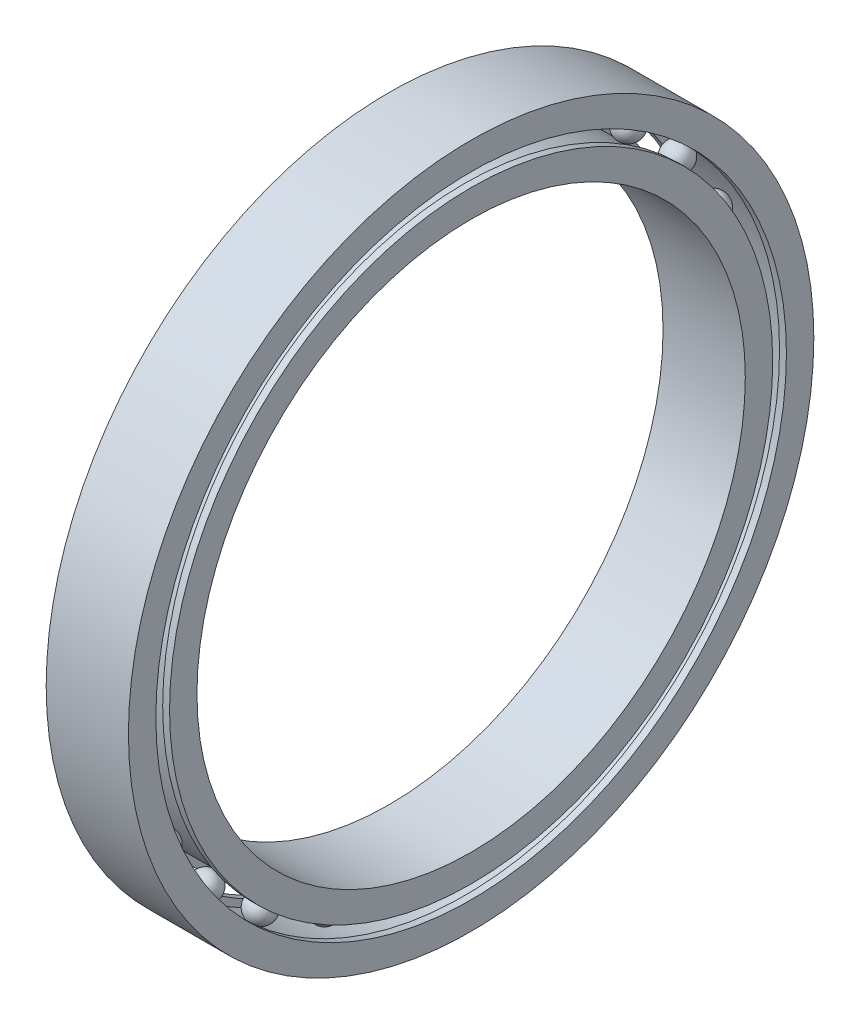
ISO-10303-21;
HEADER;
FILE_DESCRIPTION(('STEP AP214'),'2;1');
FILE_NAME('part.step','',(''),(''),'','','');
FILE_SCHEMA(('AUTOMOTIVE_DESIGN { 1 0 10303 214 1 1 1 1 }'));
ENDSEC;
DATA;
#1=APPLICATION_CONTEXT('core data for automotive mechanical design processes');
#2=APPLICATION_PROTOCOL_DEFINITION('international standard','automotive_design',2000,#1);
#3=PRODUCT_CONTEXT('',#1,'mechanical');
#4=PRODUCT('Part','Part','',(#3));
#5=PRODUCT_RELATED_PRODUCT_CATEGORY('part','',(#4));
#6=PRODUCT_DEFINITION_FORMATION('','',#4);
#7=PRODUCT_DEFINITION_CONTEXT('part definition',#1,'design');
#8=PRODUCT_DEFINITION('design','',#6,#7);
#9=PRODUCT_DEFINITION_SHAPE('','',#8);
#10=(LENGTH_UNIT() NAMED_UNIT(*) SI_UNIT(.MILLI.,.METRE.));
#11=(NAMED_UNIT(*) PLANE_ANGLE_UNIT() SI_UNIT($,.RADIAN.));
#12=(NAMED_UNIT(*) SI_UNIT($,.STERADIAN.) SOLID_ANGLE_UNIT());
#13=UNCERTAINTY_MEASURE_WITH_UNIT(LENGTH_MEASURE(1.E-05),#10,'distance_accuracy_value','');
#14=(GEOMETRIC_REPRESENTATION_CONTEXT(3) GLOBAL_UNCERTAINTY_ASSIGNED_CONTEXT((#13)) GLOBAL_UNIT_ASSIGNED_CONTEXT((#10,
#11,#12)) REPRESENTATION_CONTEXT('',''));
#15=CARTESIAN_POINT('',(0.,0.,0.));
#16=DIRECTION('',(0.,0.,1.));
#17=DIRECTION('',(1.,0.,0.));
#18=AXIS2_PLACEMENT_3D('',#15,#16,#17);
#19=CARTESIAN_POINT('',(0.,21.8935095880461,-5.1888570917046));
#20=DIRECTION('',(0.,-0.973044870579827,0.230615870742427));
#21=DIRECTION('',(0.,0.230615870742427,0.973044870579827));
#22=AXIS2_PLACEMENT_3D('',#19,#20,#21);
#23=SPHERICAL_SURFACE('',#22,1.);
#24=CARTESIAN_POINT('',(0.,20.9204647174663,-4.95824122096217));
#25=VERTEX_POINT('',#24);
#26=VERTEX_LOOP('',#25);
#27=FACE_BOUND('',#26,.T.);
#28=ADVANCED_FACE('F71',(#27),#23,.T.);
#29=CLOSED_SHELL('',(#28));
#30=MANIFOLD_SOLID_BREP('B2',#29);
#31=CARTESIAN_POINT('',(0.,20.1067344072769,-10.0979815545101));
#32=DIRECTION('',(0.,-0.893632640323418,0.448799180200451));
#33=DIRECTION('',(0.,0.448799180200451,0.893632640323418));
#34=AXIS2_PLACEMENT_3D('',#31,#32,#33);
#35=SPHERICAL_SURFACE('',#34,1.);
#36=CARTESIAN_POINT('',(0.,19.2131017669535,-9.64918237430969));
#37=VERTEX_POINT('',#36);
#38=VERTEX_LOOP('',#37);
#39=FACE_BOUND('',#38,.T.);
#40=ADVANCED_FACE('F93',(#39),#35,.T.);
#41=CLOSED_SHELL('',(#40));
#42=MANIFOLD_SOLID_BREP('B7',#41);
#43=CARTESIAN_POINT('',(0.,17.2359999701772,-14.4627212179469));
#44=DIRECTION('',(0.,-0.766044443118986,0.642787609686529));
#45=DIRECTION('',(0.,0.642787609686529,0.766044443118986));
#46=AXIS2_PLACEMENT_3D('',#43,#44,#45);
#47=SPHERICAL_SURFACE('',#46,1.);
#48=CARTESIAN_POINT('',(0.,16.4699555270582,-13.8199336082604));
#49=VERTEX_POINT('',#48);
#50=VERTEX_LOOP('',#49);
#51=FACE_BOUND('',#50,.T.);
#52=ADVANCED_FACE('F108',(#51),#47,.T.);
#53=CLOSED_SHELL('',(#52));
#54=MANIFOLD_SOLID_BREP('B68',#53);
#55=CARTESIAN_POINT('',(0.,13.4360683133129,-18.0477718369883));
#56=DIRECTION('',(0.,-0.597158591702796,0.802123192755037));
#57=DIRECTION('',(0.,0.802123192755037,0.597158591702796));
#58=AXIS2_PLACEMENT_3D('',#55,#56,#57);
#59=SPHERICAL_SURFACE('',#58,1.);
#60=CARTESIAN_POINT('',(0.,12.8389097216101,-17.2456486442333));
#61=VERTEX_POINT('',#60);
#62=VERTEX_LOOP('',#61);
#63=FACE_BOUND('',#62,.T.);
#64=ADVANCED_FACE('F130',(#63),#59,.T.);
#65=CLOSED_SHELL('',(#64));
#66=MANIFOLD_SOLID_BREP('B87',#65);
#67=CARTESIAN_POINT('',(0.,8.91179473588126,-20.6598624048061));
#68=DIRECTION('',(0.,-0.396079766039167,0.91821610688027));
#69=DIRECTION('',(0.,0.91821610688027,0.396079766039167));
#70=AXIS2_PLACEMENT_3D('',#67,#68,#69);
#71=SPHERICAL_SURFACE('',#70,1.);
#72=CARTESIAN_POINT('',(0.,8.51571496984209,-19.7416462979258));
#73=VERTEX_POINT('',#72);
#74=VERTEX_LOOP('',#73);
#75=FACE_BOUND('',#74,.T.);
#76=ADVANCED_FACE('F144',(#75),#71,.T.);
#77=CLOSED_SHELL('',(#76));
#78=MANIFOLD_SOLID_BREP('B104',#77);
#79=CARTESIAN_POINT('',(0.,3.90708399750618,-22.1581744427746));
#80=DIRECTION('',(0.,-0.173648177666941,0.984807753012206));
#81=DIRECTION('',(0.,0.984807753012206,0.173648177666941));
#82=AXIS2_PLACEMENT_3D('',#79,#80,#81);
#83=SPHERICAL_SURFACE('',#82,1.);
#84=CARTESIAN_POINT('',(0.,3.73343581983924,-21.1733666897624));
#85=VERTEX_POINT('',#84);
#86=VERTEX_LOOP('',#85);
#87=FACE_BOUND('',#86,.T.);
#88=ADVANCED_FACE('F162',(#87),#83,.T.);
#89=CLOSED_SHELL('',(#88));
#90=MANIFOLD_SOLID_BREP('B125',#89);
#91=CARTESIAN_POINT('',(0.,-1.30825865048548,-22.4619335611035));
#92=DIRECTION('',(0.,0.0581448289104656,0.998308158271269));
#93=DIRECTION('',(0.,0.998308158271269,-0.0581448289104656));
#94=AXIS2_PLACEMENT_3D('',#91,#92,#93);
#95=SPHERICAL_SURFACE('',#94,1.);
#96=CARTESIAN_POINT('',(0.,-1.25011382157501,-21.4636254028323));
#97=VERTEX_POINT('',#96);
#98=VERTEX_LOOP('',#97);
#99=FACE_BOUND('',#98,.T.);
#100=ADVANCED_FACE('F182',(#99),#95,.T.);
#101=CLOSED_SHELL('',(#100));
#102=MANIFOLD_SOLID_BREP('B143',#101);
#103=CARTESIAN_POINT('',(0.,-6.45307273599931,-21.5547640270986));
#104=DIRECTION('',(0.,0.28680323271108,0.957989512315492));
#105=DIRECTION('',(0.,0.957989512315492,-0.28680323271108));
#106=AXIS2_PLACEMENT_3D('',#103,#104,#105);
#107=SPHERICAL_SURFACE('',#106,1.);
#108=CARTESIAN_POINT('',(0.,-6.16626950328823,-20.5967745147831));
#109=VERTEX_POINT('',#108);
#110=VERTEX_LOOP('',#109);
#111=FACE_BOUND('',#110,.T.);
#112=ADVANCED_FACE('F200',(#111),#107,.T.);
#113=CLOSED_SHELL('',(#112));
#114=MANIFOLD_SOLID_BREP('B157',#113);
#115=CARTESIAN_POINT('',(0.,-11.2499999999998,-19.48557158515));
#116=DIRECTION('',(0.,0.499999999999992,0.866025403784443));
#117=DIRECTION('',(0.,0.866025403784443,-0.499999999999992));
#118=AXIS2_PLACEMENT_3D('',#115,#116,#117);
#119=SPHERICAL_SURFACE('',#118,1.);
#120=CARTESIAN_POINT('',(0.,-10.7499999999998,-18.6195461813655));
#121=VERTEX_POINT('',#120);
#122=VERTEX_LOOP('',#121);
#123=FACE_BOUND('',#122,.T.);
#124=ADVANCED_FACE('F220',(#123),#119,.T.);
#125=CLOSED_SHELL('',(#124));
#126=MANIFOLD_SOLID_BREP('B176',#125);
#127=CARTESIAN_POINT('',(0.,-15.4404368520464,-16.3659069353937));
#128=DIRECTION('',(0.,0.686241637868727,0.727373641573055));
#129=DIRECTION('',(0.,0.727373641573055,-0.686241637868727));
#130=AXIS2_PLACEMENT_3D('',#127,#128,#129);
#131=SPHERICAL_SURFACE('',#130,1.);
#132=CARTESIAN_POINT('',(0.,-14.7541952141776,-15.6385332938207));
#133=VERTEX_POINT('',#132);
#134=VERTEX_LOOP('',#133);
#135=FACE_BOUND('',#134,.T.);
#136=ADVANCED_FACE('F232',(#135),#131,.T.);
#137=CLOSED_SHELL('',(#136));
#138=MANIFOLD_SOLID_BREP('B192',#137);
#139=CARTESIAN_POINT('',(0.,-18.798475756791,-12.3639520065933));
#140=DIRECTION('',(0.,0.835487811412932,0.549508978070813));
#141=DIRECTION('',(0.,0.549508978070813,-0.835487811412932));
#142=AXIS2_PLACEMENT_3D('',#139,#140,#141);
#143=SPHERICAL_SURFACE('',#142,1.);
#144=CARTESIAN_POINT('',(0.,-17.962987945378,-11.8144430285225));
#145=VERTEX_POINT('',#144);
#146=VERTEX_LOOP('',#145);
#147=FACE_BOUND('',#146,.T.);
#148=ADVANCED_FACE('F251',(#147),#143,.T.);
#149=CLOSED_SHELL('',(#148));
#150=MANIFOLD_SOLID_BREP('B213',#149);
#151=CARTESIAN_POINT('',(0.,-21.1430839676829,-7.69545322482771));
#152=DIRECTION('',(0.,0.939692620785906,0.342020143325676));
#153=DIRECTION('',(0.,0.342020143325676,-0.939692620785906));
#154=AXIS2_PLACEMENT_3D('',#151,#152,#153);
#155=SPHERICAL_SURFACE('',#154,1.);
#156=CARTESIAN_POINT('',(0.,-20.203391346897,-7.35343308150204));
#157=VERTEX_POINT('',#156);
#158=VERTEX_LOOP('',#157);
#159=FACE_BOUND('',#158,.T.);
#160=ADVANCED_FACE('F271',(#159),#155,.T.);
#161=CLOSED_SHELL('',(#160));
#162=MANIFOLD_SOLID_BREP('B234',#161);
#163=CARTESIAN_POINT('',(0.,-22.3478630491937,-2.61209056781785));
#164=DIRECTION('',(0.,0.993238357741942,0.116092914125238));
#165=DIRECTION('',(0.,0.116092914125238,-0.993238357741942));
#166=AXIS2_PLACEMENT_3D('',#163,#164,#165);
#167=SPHERICAL_SURFACE('',#166,1.);
#168=CARTESIAN_POINT('',(0.,-21.3546246914518,-2.49599765369261));
#169=VERTEX_POINT('',#168);
#170=VERTEX_LOOP('',#169);
#171=FACE_BOUND('',#170,.T.);
#172=ADVANCED_FACE('F288',(#171),#167,.T.);
#173=CLOSED_SHELL('',(#172));
#174=MANIFOLD_SOLID_BREP('B248',#173);
#175=CARTESIAN_POINT('',(0.,-22.3478630491937,2.61209056781752));
#176=DIRECTION('',(0.,0.993238357741944,-0.116092914125223));
#177=DIRECTION('',(0.,-0.116092914125223,-0.993238357741944));
#178=AXIS2_PLACEMENT_3D('',#175,#176,#177);
#179=SPHERICAL_SURFACE('',#178,1.);
#180=CARTESIAN_POINT('',(0.,-21.3546246914518,2.4959976536923));
#181=VERTEX_POINT('',#180);
#182=VERTEX_LOOP('',#181);
#183=FACE_BOUND('',#182,.T.);
#184=ADVANCED_FACE('F307',(#183),#179,.T.);
#185=CLOSED_SHELL('',(#184));
#186=MANIFOLD_SOLID_BREP('B270',#185);
#187=CARTESIAN_POINT('',(0.,-21.143083967683,7.69545322482741));
#188=DIRECTION('',(0.,0.939692620785911,-0.342020143325663));
#189=DIRECTION('',(0.,-0.342020143325663,-0.939692620785911));
#190=AXIS2_PLACEMENT_3D('',#187,#188,#189);
#191=SPHERICAL_SURFACE('',#190,1.);
#192=CARTESIAN_POINT('',(0.,-20.2033913468971,7.35343308150174));
#193=VERTEX_POINT('',#192);
#194=VERTEX_LOOP('',#193);
#195=FACE_BOUND('',#194,.T.);
#196=ADVANCED_FACE('F324',(#195),#191,.T.);
#197=CLOSED_SHELL('',(#196));
#198=MANIFOLD_SOLID_BREP('B283',#197);
#199=CARTESIAN_POINT('',(0.,-18.7984757567911,12.363952006593));
#200=DIRECTION('',(0.,0.835487811412939,-0.549508978070801));
#201=DIRECTION('',(0.,-0.549508978070801,-0.835487811412939));
#202=AXIS2_PLACEMENT_3D('',#199,#200,#201);
#203=SPHERICAL_SURFACE('',#202,1.);
#204=CARTESIAN_POINT('',(0.,-17.9629879453782,11.8144430285222));
#205=VERTEX_POINT('',#204);
#206=VERTEX_LOOP('',#205);
#207=FACE_BOUND('',#206,.T.);
#208=ADVANCED_FACE('F345',(#207),#203,.T.);
#209=CLOSED_SHELL('',(#208));
#210=MANIFOLD_SOLID_BREP('B305',#209);
#211=CARTESIAN_POINT('',(0.,-15.4404368520466,16.3659069353935));
#212=DIRECTION('',(0.,0.686241637868737,-0.727373641573045));
#213=DIRECTION('',(0.,-0.727373641573045,-0.686241637868737));
#214=AXIS2_PLACEMENT_3D('',#211,#212,#213);
#215=SPHERICAL_SURFACE('',#214,1.);
#216=CARTESIAN_POINT('',(0.,-14.7541952141778,15.6385332938205));
#217=VERTEX_POINT('',#216);
#218=VERTEX_LOOP('',#217);
#219=FACE_BOUND('',#218,.T.);
#220=ADVANCED_FACE('F363',(#219),#215,.T.);
#221=CLOSED_SHELL('',(#220));
#222=MANIFOLD_SOLID_BREP('B321',#221);
#223=CARTESIAN_POINT('',(0.,-11.2500000000001,19.4855715851498));
#224=DIRECTION('',(0.,0.500000000000004,-0.866025403784436));
#225=DIRECTION('',(0.,-0.866025403784436,-0.500000000000004));
#226=AXIS2_PLACEMENT_3D('',#223,#224,#225);
#227=SPHERICAL_SURFACE('',#226,1.);
#228=CARTESIAN_POINT('',(0.,-10.7500000000001,18.6195461813654));
#229=VERTEX_POINT('',#228);
#230=VERTEX_LOOP('',#229);
#231=FACE_BOUND('',#230,.T.);
#232=ADVANCED_FACE('F377',(#231),#227,.T.);
#233=CLOSED_SHELL('',(#232));
#234=MANIFOLD_SOLID_BREP('B336',#233);
#235=CARTESIAN_POINT('',(0.,-6.45307273599962,21.5547640270985));
#236=DIRECTION('',(0.,0.286803232711094,-0.957989512315488));
#237=DIRECTION('',(0.,-0.957989512315488,-0.286803232711094));
#238=AXIS2_PLACEMENT_3D('',#235,#236,#237);
#239=SPHERICAL_SURFACE('',#238,1.);
#240=CARTESIAN_POINT('',(0.,-6.16626950328853,20.596774514783));
#241=VERTEX_POINT('',#240);
#242=VERTEX_LOOP('',#241);
#243=FACE_BOUND('',#242,.T.);
#244=ADVANCED_FACE('F396',(#243),#239,.T.);
#245=CLOSED_SHELL('',(#244));
#246=MANIFOLD_SOLID_BREP('B356',#245);
#247=CARTESIAN_POINT('',(0.,-1.30825865048579,22.4619335611035));
#248=DIRECTION('',(0.,0.0581448289104796,-0.998308158271268));
#249=DIRECTION('',(0.,-0.998308158271268,-0.0581448289104796));
#250=AXIS2_PLACEMENT_3D('',#247,#248,#249);
#251=SPHERICAL_SURFACE('',#250,1.);
#252=CARTESIAN_POINT('',(0.,-1.25011382157531,21.4636254028323));
#253=VERTEX_POINT('',#252);
#254=VERTEX_LOOP('',#253);
#255=FACE_BOUND('',#254,.T.);
#256=ADVANCED_FACE('F412',(#255),#251,.T.);
#257=CLOSED_SHELL('',(#256));
#258=MANIFOLD_SOLID_BREP('B374',#257);
#259=CARTESIAN_POINT('',(0.,3.90708399750586,22.1581744427747));
#260=DIRECTION('',(0.,-0.173648177666927,-0.984807753012209));
#261=DIRECTION('',(0.,-0.984807753012209,0.173648177666927));
#262=AXIS2_PLACEMENT_3D('',#259,#260,#261);
#263=SPHERICAL_SURFACE('',#262,1.);
#264=CARTESIAN_POINT('',(0.,3.73343581983893,21.1733666897625));
#265=VERTEX_POINT('',#264);
#266=VERTEX_LOOP('',#265);
#267=FACE_BOUND('',#266,.T.);
#268=ADVANCED_FACE('F433',(#267),#263,.T.);
#269=CLOSED_SHELL('',(#268));
#270=MANIFOLD_SOLID_BREP('B395',#269);
#271=CARTESIAN_POINT('',(0.,8.91179473588097,20.6598624048062));
#272=DIRECTION('',(0.,-0.396079766039154,-0.918216106880275));
#273=DIRECTION('',(0.,-0.918216106880275,0.396079766039154));
#274=AXIS2_PLACEMENT_3D('',#271,#272,#273);
#275=SPHERICAL_SURFACE('',#274,1.);
#276=CARTESIAN_POINT('',(0.,8.51571496984182,19.7416462979259));
#277=VERTEX_POINT('',#276);
#278=VERTEX_LOOP('',#277);
#279=FACE_BOUND('',#278,.T.);
#280=ADVANCED_FACE('F454',(#279),#275,.T.);
#281=CLOSED_SHELL('',(#280));
#282=MANIFOLD_SOLID_BREP('B414',#281);
#283=CARTESIAN_POINT('',(0.,13.4360683133127,18.0477718369885));
#284=DIRECTION('',(0.,-0.597158591702785,-0.802123192755045));
#285=DIRECTION('',(0.,-0.802123192755045,0.597158591702785));
#286=AXIS2_PLACEMENT_3D('',#283,#284,#285);
#287=SPHERICAL_SURFACE('',#286,1.);
#288=CARTESIAN_POINT('',(0.,12.8389097216099,17.2456486442335));
#289=VERTEX_POINT('',#288);
#290=VERTEX_LOOP('',#289);
#291=FACE_BOUND('',#290,.T.);
#292=ADVANCED_FACE('F468',(#291),#287,.T.);
#293=CLOSED_SHELL('',(#292));
#294=MANIFOLD_SOLID_BREP('B427',#293);
#295=CARTESIAN_POINT('',(0.,17.235999970177,14.4627212179472));
#296=DIRECTION('',(0.,-0.766044443118977,-0.642787609686541));
#297=DIRECTION('',(0.,-0.642787609686541,0.766044443118977));
#298=AXIS2_PLACEMENT_3D('',#295,#296,#297);
#299=SPHERICAL_SURFACE('',#298,1.);
#300=CARTESIAN_POINT('',(0.,16.469955527058,13.8199336082606));
#301=VERTEX_POINT('',#300);
#302=VERTEX_LOOP('',#301);
#303=FACE_BOUND('',#302,.T.);
#304=ADVANCED_FACE('F490',(#303),#299,.T.);
#305=CLOSED_SHELL('',(#304));
#306=MANIFOLD_SOLID_BREP('B449',#305);
#307=CARTESIAN_POINT('',(0.,20.1067344072768,10.0979815545104));
#308=DIRECTION('',(0.,-0.893632640323412,-0.448799180200463));
#309=DIRECTION('',(0.,-0.448799180200463,0.893632640323412));
#310=AXIS2_PLACEMENT_3D('',#307,#308,#309);
#311=SPHERICAL_SURFACE('',#310,1.);
#312=CARTESIAN_POINT('',(0.,19.2131017669534,9.64918237430996));
#313=VERTEX_POINT('',#312);
#314=VERTEX_LOOP('',#313);
#315=FACE_BOUND('',#314,.T.);
#316=ADVANCED_FACE('F503',(#315),#311,.T.);
#317=CLOSED_SHELL('',(#316));
#318=MANIFOLD_SOLID_BREP('B463',#317);
#319=CARTESIAN_POINT('',(0.,21.893509588046,5.18885709170492));
#320=DIRECTION('',(0.,-0.973044870579824,-0.230615870742441));
#321=DIRECTION('',(0.,-0.230615870742441,0.973044870579824));
#322=AXIS2_PLACEMENT_3D('',#319,#320,#321);
#323=SPHERICAL_SURFACE('',#322,1.);
#324=CARTESIAN_POINT('',(0.,20.9204647174662,4.95824122096248));
#325=VERTEX_POINT('',#324);
#326=VERTEX_LOOP('',#325);
#327=FACE_BOUND('',#326,.T.);
#328=ADVANCED_FACE('F525',(#327),#323,.T.);
#329=CLOSED_SHELL('',(#328));
#330=MANIFOLD_SOLID_BREP('B483',#329);
#331=CARTESIAN_POINT('',(0.,22.5,0.));
#332=DIRECTION('',(0.,-1.,0.));
#333=DIRECTION('',(0.,0.,1.));
#334=AXIS2_PLACEMENT_3D('',#331,#332,#333);
#335=SPHERICAL_SURFACE('',#334,1.);
#336=CARTESIAN_POINT('',(0.,21.5,0.));
#337=VERTEX_POINT('',#336);
#338=VERTEX_LOOP('',#337);
#339=FACE_BOUND('',#338,.T.);
#340=ADVANCED_FACE('F543',(#339),#335,.T.);
#341=CLOSED_SHELL('',(#340));
#342=MANIFOLD_SOLID_BREP('B502',#341);
#343=CARTESIAN_POINT('',(-3.,0.,0.));
#344=DIRECTION('',(1.,0.,0.));
#345=DIRECTION('',(0.,0.,-1.));
#346=AXIS2_PLACEMENT_3D('',#343,#344,#345);
#347=CYLINDRICAL_SURFACE('',#346,23.5);
#348=CARTESIAN_POINT('',(2.5,0.,0.));
#349=DIRECTION('',(1.,0.,0.));
#350=DIRECTION('',(0.,0.,-1.));
#351=AXIS2_PLACEMENT_3D('',#348,#349,#350);
#352=CIRCLE('',#351,23.5);
#353=CARTESIAN_POINT('',(2.5,0.,-23.5));
#354=VERTEX_POINT('',#353);
#355=EDGE_CURVE('E569',#354,#354,#352,.F.);
#356=ORIENTED_EDGE('',*,*,#355,.F.);
#357=EDGE_LOOP('',(#356));
#358=FACE_BOUND('',#357,.T.);
#359=CARTESIAN_POINT('',(-2.5,0.,0.));
#360=DIRECTION('',(-1.,0.,0.));
#361=DIRECTION('',(0.,0.,1.));
#362=AXIS2_PLACEMENT_3D('',#359,#360,#361);
#363=CIRCLE('',#362,23.5);
#364=CARTESIAN_POINT('',(-2.5,0.,23.5));
#365=VERTEX_POINT('',#364);
#366=EDGE_CURVE('E545',#365,#365,#363,.F.);
#367=ORIENTED_EDGE('',*,*,#366,.F.);
#368=EDGE_LOOP('',(#367));
#369=FACE_BOUND('',#368,.T.);
#370=ADVANCED_FACE('F565',(#358,#369),#347,.F.);
#371=CARTESIAN_POINT('',(-3.,0.,0.));
#372=DIRECTION('',(1.,0.,0.));
#373=DIRECTION('',(0.,0.,-1.));
#374=AXIS2_PLACEMENT_3D('',#371,#372,#373);
#375=CYLINDRICAL_SURFACE('',#374,25.);
#376=CARTESIAN_POINT('',(-3.,0.,0.));
#377=DIRECTION('',(1.,0.,0.));
#378=DIRECTION('',(0.,0.,-1.));
#379=AXIS2_PLACEMENT_3D('',#376,#377,#378);
#380=CIRCLE('',#379,25.);
#381=CARTESIAN_POINT('',(-3.,0.,-25.));
#382=VERTEX_POINT('',#381);
#383=EDGE_CURVE('E575',#382,#382,#380,.T.);
#384=ORIENTED_EDGE('',*,*,#383,.T.);
#385=EDGE_LOOP('',(#384));
#386=FACE_BOUND('',#385,.T.);
#387=CARTESIAN_POINT('',(3.,0.,0.));
#388=DIRECTION('',(1.,0.,0.));
#389=DIRECTION('',(0.,0.,-1.));
#390=AXIS2_PLACEMENT_3D('',#387,#388,#389);
#391=CIRCLE('',#390,25.);
#392=CARTESIAN_POINT('',(3.,0.,-25.));
#393=VERTEX_POINT('',#392);
#394=EDGE_CURVE('E576',#393,#393,#391,.T.);
#395=ORIENTED_EDGE('',*,*,#394,.F.);
#396=EDGE_LOOP('',(#395));
#397=FACE_BOUND('',#396,.T.);
#398=ADVANCED_FACE('F610',(#386,#397),#375,.T.);
#399=CARTESIAN_POINT('',(-3.,0.,0.));
#400=DIRECTION('',(1.,0.,0.));
#401=DIRECTION('',(0.,0.,-1.));
#402=AXIS2_PLACEMENT_3D('',#399,#400,#401);
#403=PLANE('',#402);
#404=ORIENTED_EDGE('',*,*,#383,.F.);
#405=EDGE_LOOP('',(#404));
#406=FACE_BOUND('',#405,.T.);
#407=CARTESIAN_POINT('',(-3.,0.,0.));
#408=DIRECTION('',(-1.,0.,0.));
#409=DIRECTION('',(0.,0.,1.));
#410=AXIS2_PLACEMENT_3D('',#407,#408,#409);
#411=CIRCLE('',#410,23.);
#412=CARTESIAN_POINT('',(-3.,0.,23.));
#413=VERTEX_POINT('',#412);
#414=EDGE_CURVE('E589',#413,#413,#411,.T.);
#415=ORIENTED_EDGE('',*,*,#414,.F.);
#416=EDGE_LOOP('',(#415));
#417=FACE_BOUND('',#416,.T.);
#418=ADVANCED_FACE('F603',(#406,#417),#403,.F.);
#419=CARTESIAN_POINT('',(3.,0.,0.));
#420=DIRECTION('',(1.,0.,0.));
#421=DIRECTION('',(0.,0.,-1.));
#422=AXIS2_PLACEMENT_3D('',#419,#420,#421);
#423=PLANE('',#422);
#424=ORIENTED_EDGE('',*,*,#394,.T.);
#425=EDGE_LOOP('',(#424));
#426=FACE_BOUND('',#425,.T.);
#427=CARTESIAN_POINT('',(3.,0.,0.));
#428=DIRECTION('',(1.,0.,0.));
#429=DIRECTION('',(0.,0.,-1.));
#430=AXIS2_PLACEMENT_3D('',#427,#428,#429);
#431=CIRCLE('',#430,23.);
#432=CARTESIAN_POINT('',(3.,0.,-23.));
#433=VERTEX_POINT('',#432);
#434=EDGE_CURVE('E581',#433,#433,#431,.T.);
#435=ORIENTED_EDGE('',*,*,#434,.F.);
#436=EDGE_LOOP('',(#435));
#437=FACE_BOUND('',#436,.T.);
#438=ADVANCED_FACE('F607',(#426,#437),#423,.T.);
#439=CARTESIAN_POINT('',(2.5,0.,0.));
#440=DIRECTION('',(1.,0.,0.));
#441=DIRECTION('',(0.,0.,-1.));
#442=AXIS2_PLACEMENT_3D('',#439,#440,#441);
#443=CYLINDRICAL_SURFACE('',#442,23.);
#444=CARTESIAN_POINT('',(2.5,0.,0.));
#445=DIRECTION('',(1.,0.,0.));
#446=DIRECTION('',(0.,0.,-1.));
#447=AXIS2_PLACEMENT_3D('',#444,#445,#446);
#448=CIRCLE('',#447,23.);
#449=CARTESIAN_POINT('',(2.5,0.,-23.));
#450=VERTEX_POINT('',#449);
#451=EDGE_CURVE('E582',#450,#450,#448,.T.);
#452=ORIENTED_EDGE('',*,*,#451,.F.);
#453=EDGE_LOOP('',(#452));
#454=FACE_BOUND('',#453,.T.);
#455=ORIENTED_EDGE('',*,*,#434,.T.);
#456=EDGE_LOOP('',(#455));
#457=FACE_BOUND('',#456,.T.);
#458=ADVANCED_FACE('F611',(#454,#457),#443,.F.);
#459=CARTESIAN_POINT('',(2.5,0.,0.));
#460=DIRECTION('',(1.,0.,0.));
#461=DIRECTION('',(0.,0.,-1.));
#462=AXIS2_PLACEMENT_3D('',#459,#460,#461);
#463=PLANE('',#462);
#464=ORIENTED_EDGE('',*,*,#451,.T.);
#465=EDGE_LOOP('',(#464));
#466=FACE_BOUND('',#465,.T.);
#467=ORIENTED_EDGE('',*,*,#355,.T.);
#468=EDGE_LOOP('',(#467));
#469=FACE_BOUND('',#468,.T.);
#470=ADVANCED_FACE('F599',(#466,#469),#463,.F.);
#471=CARTESIAN_POINT('',(-2.5,0.,0.));
#472=DIRECTION('',(-1.,0.,0.));
#473=DIRECTION('',(0.,0.,1.));
#474=AXIS2_PLACEMENT_3D('',#471,#472,#473);
#475=CYLINDRICAL_SURFACE('',#474,23.);
#476=CARTESIAN_POINT('',(-2.5,0.,0.));
#477=DIRECTION('',(-1.,0.,0.));
#478=DIRECTION('',(0.,0.,1.));
#479=AXIS2_PLACEMENT_3D('',#476,#477,#478);
#480=CIRCLE('',#479,23.);
#481=CARTESIAN_POINT('',(-2.5,0.,23.));
#482=VERTEX_POINT('',#481);
#483=EDGE_CURVE('E588',#482,#482,#480,.T.);
#484=ORIENTED_EDGE('',*,*,#483,.F.);
#485=EDGE_LOOP('',(#484));
#486=FACE_BOUND('',#485,.T.);
#487=ORIENTED_EDGE('',*,*,#414,.T.);
#488=EDGE_LOOP('',(#487));
#489=FACE_BOUND('',#488,.T.);
#490=ADVANCED_FACE('F600',(#486,#489),#475,.F.);
#491=CARTESIAN_POINT('',(-2.5,0.,0.));
#492=DIRECTION('',(-1.,0.,0.));
#493=DIRECTION('',(0.,0.,1.));
#494=AXIS2_PLACEMENT_3D('',#491,#492,#493);
#495=PLANE('',#494);
#496=ORIENTED_EDGE('',*,*,#483,.T.);
#497=EDGE_LOOP('',(#496));
#498=FACE_BOUND('',#497,.T.);
#499=ORIENTED_EDGE('',*,*,#366,.T.);
#500=EDGE_LOOP('',(#499));
#501=FACE_BOUND('',#500,.T.);
#502=ADVANCED_FACE('F594',(#498,#501),#495,.F.);
#503=CLOSED_SHELL('',(#370,#398,#418,#438,#458,#470,#490,#502));
#504=MANIFOLD_SOLID_BREP('B516',#503);
#505=CARTESIAN_POINT('',(-3.,0.,0.));
#506=DIRECTION('',(1.,0.,0.));
#507=DIRECTION('',(0.,0.,-1.));
#508=AXIS2_PLACEMENT_3D('',#505,#506,#507);
#509=CYLINDRICAL_SURFACE('',#508,21.5);
#510=CARTESIAN_POINT('',(2.5,0.,0.));
#511=DIRECTION('',(1.,0.,0.));
#512=DIRECTION('',(0.,0.,-1.));
#513=AXIS2_PLACEMENT_3D('',#510,#511,#512);
#514=CIRCLE('',#513,21.5);
#515=CARTESIAN_POINT('',(2.5,0.,-21.5));
#516=VERTEX_POINT('',#515);
#517=EDGE_CURVE('E706',#516,#516,#514,.T.);
#518=ORIENTED_EDGE('',*,*,#517,.F.);
#519=EDGE_LOOP('',(#518));
#520=FACE_BOUND('',#519,.T.);
#521=CARTESIAN_POINT('',(-2.5,0.,0.));
#522=DIRECTION('',(-1.,0.,0.));
#523=DIRECTION('',(0.,0.,1.));
#524=AXIS2_PLACEMENT_3D('',#521,#522,#523);
#525=CIRCLE('',#524,21.5);
#526=CARTESIAN_POINT('',(-2.5,0.,21.5));
#527=VERTEX_POINT('',#526);
#528=EDGE_CURVE('E719',#527,#527,#525,.T.);
#529=ORIENTED_EDGE('',*,*,#528,.F.);
#530=EDGE_LOOP('',(#529));
#531=FACE_BOUND('',#530,.T.);
#532=ADVANCED_FACE('F693',(#520,#531),#509,.T.);
#533=CARTESIAN_POINT('',(-3.,0.,0.));
#534=DIRECTION('',(1.,0.,0.));
#535=DIRECTION('',(0.,0.,-1.));
#536=AXIS2_PLACEMENT_3D('',#533,#534,#535);
#537=CYLINDRICAL_SURFACE('',#536,20.);
#538=CARTESIAN_POINT('',(-3.,0.,0.));
#539=DIRECTION('',(1.,0.,0.));
#540=DIRECTION('',(0.,0.,-1.));
#541=AXIS2_PLACEMENT_3D('',#538,#539,#540);
#542=CIRCLE('',#541,20.);
#543=CARTESIAN_POINT('',(-3.,0.,-20.));
#544=VERTEX_POINT('',#543);
#545=EDGE_CURVE('E561',#544,#544,#542,.T.);
#546=ORIENTED_EDGE('',*,*,#545,.F.);
#547=EDGE_LOOP('',(#546));
#548=FACE_BOUND('',#547,.T.);
#549=CARTESIAN_POINT('',(3.,0.,0.));
#550=DIRECTION('',(1.,0.,0.));
#551=DIRECTION('',(0.,0.,-1.));
#552=AXIS2_PLACEMENT_3D('',#549,#550,#551);
#553=CIRCLE('',#552,20.);
#554=CARTESIAN_POINT('',(3.,0.,-20.));
#555=VERTEX_POINT('',#554);
#556=EDGE_CURVE('E696',#555,#555,#553,.T.);
#557=ORIENTED_EDGE('',*,*,#556,.T.);
#558=EDGE_LOOP('',(#557));
#559=FACE_BOUND('',#558,.T.);
#560=ADVANCED_FACE('F691',(#548,#559),#537,.F.);
#561=CARTESIAN_POINT('',(-3.,0.,0.));
#562=DIRECTION('',(1.,0.,0.));
#563=DIRECTION('',(0.,0.,-1.));
#564=AXIS2_PLACEMENT_3D('',#561,#562,#563);
#565=PLANE('',#564);
#566=ORIENTED_EDGE('',*,*,#545,.T.);
#567=EDGE_LOOP('',(#566));
#568=FACE_BOUND('',#567,.T.);
#569=CARTESIAN_POINT('',(-3.,0.,0.));
#570=DIRECTION('',(-1.,0.,0.));
#571=DIRECTION('',(0.,0.,1.));
#572=AXIS2_PLACEMENT_3D('',#569,#570,#571);
#573=CIRCLE('',#572,22.);
#574=CARTESIAN_POINT('',(-3.,0.,22.));
#575=VERTEX_POINT('',#574);
#576=EDGE_CURVE('E714',#575,#575,#573,.T.);
#577=ORIENTED_EDGE('',*,*,#576,.T.);
#578=EDGE_LOOP('',(#577));
#579=FACE_BOUND('',#578,.T.);
#580=ADVANCED_FACE('F734',(#568,#579),#565,.F.);
#581=CARTESIAN_POINT('',(3.,0.,0.));
#582=DIRECTION('',(1.,0.,0.));
#583=DIRECTION('',(0.,0.,-1.));
#584=AXIS2_PLACEMENT_3D('',#581,#582,#583);
#585=PLANE('',#584);
#586=ORIENTED_EDGE('',*,*,#556,.F.);
#587=EDGE_LOOP('',(#586));
#588=FACE_BOUND('',#587,.T.);
#589=CARTESIAN_POINT('',(3.,0.,0.));
#590=DIRECTION('',(1.,0.,0.));
#591=DIRECTION('',(0.,0.,-1.));
#592=AXIS2_PLACEMENT_3D('',#589,#590,#591);
#593=CIRCLE('',#592,22.);
#594=CARTESIAN_POINT('',(3.,0.,-22.));
#595=VERTEX_POINT('',#594);
#596=EDGE_CURVE('E707',#595,#595,#593,.T.);
#597=ORIENTED_EDGE('',*,*,#596,.T.);
#598=EDGE_LOOP('',(#597));
#599=FACE_BOUND('',#598,.T.);
#600=ADVANCED_FACE('F736',(#588,#599),#585,.T.);
#601=CARTESIAN_POINT('',(2.5,0.,0.));
#602=DIRECTION('',(1.,0.,0.));
#603=DIRECTION('',(0.,0.,-1.));
#604=AXIS2_PLACEMENT_3D('',#601,#602,#603);
#605=CYLINDRICAL_SURFACE('',#604,22.);
#606=CARTESIAN_POINT('',(2.5,0.,0.));
#607=DIRECTION('',(1.,0.,0.));
#608=DIRECTION('',(0.,0.,-1.));
#609=AXIS2_PLACEMENT_3D('',#606,#607,#608);
#610=CIRCLE('',#609,22.);
#611=CARTESIAN_POINT('',(2.5,0.,-22.));
#612=VERTEX_POINT('',#611);
#613=EDGE_CURVE('E705',#612,#612,#610,.T.);
#614=ORIENTED_EDGE('',*,*,#613,.T.);
#615=EDGE_LOOP('',(#614));
#616=FACE_BOUND('',#615,.T.);
#617=ORIENTED_EDGE('',*,*,#596,.F.);
#618=EDGE_LOOP('',(#617));
#619=FACE_BOUND('',#618,.T.);
#620=ADVANCED_FACE('F741',(#616,#619),#605,.T.);
#621=CARTESIAN_POINT('',(2.5,0.,0.));
#622=DIRECTION('',(1.,0.,0.));
#623=DIRECTION('',(0.,0.,-1.));
#624=AXIS2_PLACEMENT_3D('',#621,#622,#623);
#625=PLANE('',#624);
#626=ORIENTED_EDGE('',*,*,#517,.T.);
#627=EDGE_LOOP('',(#626));
#628=FACE_BOUND('',#627,.T.);
#629=ORIENTED_EDGE('',*,*,#613,.F.);
#630=EDGE_LOOP('',(#629));
#631=FACE_BOUND('',#630,.T.);
#632=ADVANCED_FACE('F748',(#628,#631),#625,.F.);
#633=CARTESIAN_POINT('',(-2.5,0.,0.));
#634=DIRECTION('',(-1.,0.,0.));
#635=DIRECTION('',(0.,0.,1.));
#636=AXIS2_PLACEMENT_3D('',#633,#634,#635);
#637=CYLINDRICAL_SURFACE('',#636,22.);
#638=CARTESIAN_POINT('',(-2.5,0.,0.));
#639=DIRECTION('',(-1.,0.,0.));
#640=DIRECTION('',(0.,0.,1.));
#641=AXIS2_PLACEMENT_3D('',#638,#639,#640);
#642=CIRCLE('',#641,22.);
#643=CARTESIAN_POINT('',(-2.5,0.,22.));
#644=VERTEX_POINT('',#643);
#645=EDGE_CURVE('E711',#644,#644,#642,.T.);
#646=ORIENTED_EDGE('',*,*,#645,.T.);
#647=EDGE_LOOP('',(#646));
#648=FACE_BOUND('',#647,.T.);
#649=ORIENTED_EDGE('',*,*,#576,.F.);
#650=EDGE_LOOP('',(#649));
#651=FACE_BOUND('',#650,.T.);
#652=ADVANCED_FACE('F750',(#648,#651),#637,.T.);
#653=CARTESIAN_POINT('',(-2.5,0.,0.));
#654=DIRECTION('',(-1.,0.,0.));
#655=DIRECTION('',(0.,0.,1.));
#656=AXIS2_PLACEMENT_3D('',#653,#654,#655);
#657=PLANE('',#656);
#658=ORIENTED_EDGE('',*,*,#528,.T.);
#659=EDGE_LOOP('',(#658));
#660=FACE_BOUND('',#659,.T.);
#661=ORIENTED_EDGE('',*,*,#645,.F.);
#662=EDGE_LOOP('',(#661));
#663=FACE_BOUND('',#662,.T.);
#664=ADVANCED_FACE('F721',(#660,#663),#657,.F.);
#665=CLOSED_SHELL('',(#532,#560,#580,#600,#620,#632,#652,#664));
#666=MANIFOLD_SOLID_BREP('B540',#665);
#667=ADVANCED_BREP_SHAPE_REPRESENTATION('',(#18,#30,#42,#54,#66,#78,#90,#102,#114,#126,#138,
#150,#162,#174,#186,#198,#210,#222,#234,#246,#258,#270,#282,#294,#306,#318,#330,#342,#504,#666),#14);
#668=SHAPE_DEFINITION_REPRESENTATION(#9,#667);
ENDSEC;
END-ISO-10303-21;
